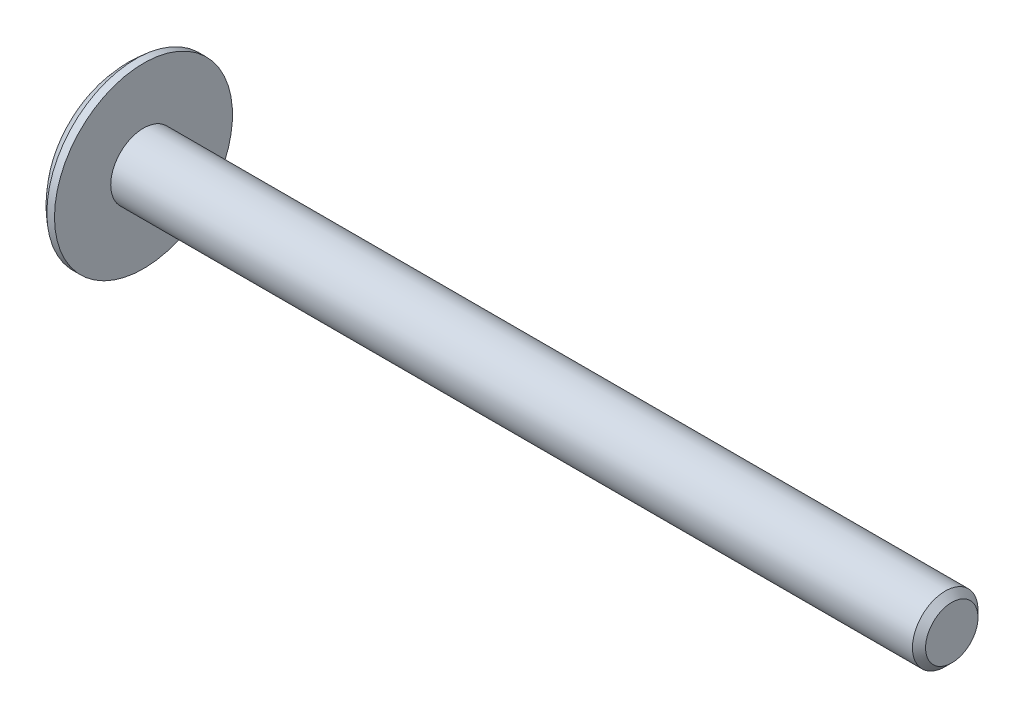
ISO-10303-21;
HEADER;
FILE_DESCRIPTION(('STEP AP214'),'2;1');
FILE_NAME('part.step','',(''),(''),'','','');
FILE_SCHEMA(('AUTOMOTIVE_DESIGN { 1 0 10303 214 1 1 1 1 }'));
ENDSEC;
DATA;
#1=APPLICATION_CONTEXT('core data for automotive mechanical design processes');
#2=APPLICATION_PROTOCOL_DEFINITION('international standard','automotive_design',2000,#1);
#3=PRODUCT_CONTEXT('',#1,'mechanical');
#4=PRODUCT('Part','Part','',(#3));
#5=PRODUCT_RELATED_PRODUCT_CATEGORY('part','',(#4));
#6=PRODUCT_DEFINITION_FORMATION('','',#4);
#7=PRODUCT_DEFINITION_CONTEXT('part definition',#1,'design');
#8=PRODUCT_DEFINITION('design','',#6,#7);
#9=PRODUCT_DEFINITION_SHAPE('','',#8);
#10=(LENGTH_UNIT() NAMED_UNIT(*) SI_UNIT(.MILLI.,.METRE.));
#11=(NAMED_UNIT(*) PLANE_ANGLE_UNIT() SI_UNIT($,.RADIAN.));
#12=(NAMED_UNIT(*) SI_UNIT($,.STERADIAN.) SOLID_ANGLE_UNIT());
#13=UNCERTAINTY_MEASURE_WITH_UNIT(LENGTH_MEASURE(1.E-05),#10,'distance_accuracy_value','');
#14=(GEOMETRIC_REPRESENTATION_CONTEXT(3) GLOBAL_UNCERTAINTY_ASSIGNED_CONTEXT((#13)) GLOBAL_UNIT_ASSIGNED_CONTEXT((#10,
#11,#12)) REPRESENTATION_CONTEXT('',''));
#15=CARTESIAN_POINT('',(0.,0.,0.));
#16=DIRECTION('',(0.,0.,1.));
#17=DIRECTION('',(1.,0.,0.));
#18=AXIS2_PLACEMENT_3D('',#15,#16,#17);
#19=CARTESIAN_POINT('',(0.,0.,0.));
#20=DIRECTION('',(1.,0.,0.));
#21=DIRECTION('',(0.,0.,-1.));
#22=AXIS2_PLACEMENT_3D('',#19,#20,#21);
#23=PLANE('',#22);
#24=DIRECTION('',(0.,-0.5,-0.866025403784439));
#25=VECTOR('',#24,1.);
#26=CARTESIAN_POINT('',(0.,1.15470053837925,0.));
#27=LINE('',#26,#25);
#28=CARTESIAN_POINT('',(0.,1.15470053837925,0.));
#29=VERTEX_POINT('',#28);
#30=CARTESIAN_POINT('',(0.,0.577350269189626,-1.));
#31=VERTEX_POINT('',#30);
#32=EDGE_CURVE('E131',#29,#31,#27,.T.);
#33=ORIENTED_EDGE('',*,*,#32,.F.);
#34=DIRECTION('',(0.,0.5,-0.866025403784439));
#35=VECTOR('',#34,1.);
#36=CARTESIAN_POINT('',(0.,0.577350269189626,1.));
#37=LINE('',#36,#35);
#38=CARTESIAN_POINT('',(0.,0.577350269189626,1.));
#39=VERTEX_POINT('',#38);
#40=EDGE_CURVE('E57',#39,#29,#37,.T.);
#41=ORIENTED_EDGE('',*,*,#40,.F.);
#42=DIRECTION('',(0.,1.,0.));
#43=VECTOR('',#42,1.);
#44=CARTESIAN_POINT('',(0.,-0.577350269189626,1.));
#45=LINE('',#44,#43);
#46=CARTESIAN_POINT('',(0.,-0.577350269189626,1.));
#47=VERTEX_POINT('',#46);
#48=EDGE_CURVE('E140',#47,#39,#45,.T.);
#49=ORIENTED_EDGE('',*,*,#48,.F.);
#50=DIRECTION('',(0.,0.5,0.866025403784439));
#51=VECTOR('',#50,1.);
#52=CARTESIAN_POINT('',(0.,-1.15470053837925,0.));
#53=LINE('',#52,#51);
#54=CARTESIAN_POINT('',(0.,-1.15470053837925,0.));
#55=VERTEX_POINT('',#54);
#56=EDGE_CURVE('E138',#55,#47,#53,.T.);
#57=ORIENTED_EDGE('',*,*,#56,.F.);
#58=DIRECTION('',(0.,-0.5,0.866025403784438));
#59=VECTOR('',#58,1.);
#60=CARTESIAN_POINT('',(0.,-0.577350269189626,-1.));
#61=LINE('',#60,#59);
#62=CARTESIAN_POINT('',(0.,-0.577350269189626,-1.));
#63=VERTEX_POINT('',#62);
#64=EDGE_CURVE('E105',#63,#55,#61,.T.);
#65=ORIENTED_EDGE('',*,*,#64,.F.);
#66=DIRECTION('',(0.,-1.,0.));
#67=VECTOR('',#66,1.);
#68=CARTESIAN_POINT('',(0.,0.577350269189626,-1.));
#69=LINE('',#68,#67);
#70=EDGE_CURVE('E134',#31,#63,#69,.T.);
#71=ORIENTED_EDGE('',*,*,#70,.F.);
#72=EDGE_LOOP('',(#33,#41,#49,#57,#65,#71));
#73=FACE_BOUND('',#72,.T.);
#74=CARTESIAN_POINT('',(0.,0.,0.));
#75=DIRECTION('',(-1.,0.,0.));
#76=DIRECTION('',(0.,0.,1.));
#77=AXIS2_PLACEMENT_3D('',#74,#75,#76);
#78=CIRCLE('',#77,1.425);
#79=CARTESIAN_POINT('',(0.,0.,1.425));
#80=VERTEX_POINT('',#79);
#81=EDGE_CURVE('E11',#80,#80,#78,.T.);
#82=ORIENTED_EDGE('',*,*,#81,.T.);
#83=EDGE_LOOP('',(#82));
#84=FACE_BOUND('',#83,.T.);
#85=ADVANCED_FACE('F43',(#73,#84),#23,.F.);
#86=CARTESIAN_POINT('',(3.35,0.,0.));
#87=DIRECTION('',(-1.,0.,0.));
#88=DIRECTION('',(0.,0.,1.));
#89=AXIS2_PLACEMENT_3D('',#86,#87,#88);
#90=DEGENERATE_TOROIDAL_SURFACE('',#89,1.425,3.35,.T.);
#91=ORIENTED_EDGE('',*,*,#81,.F.);
#92=EDGE_LOOP('',(#91));
#93=FACE_BOUND('',#92,.T.);
#94=CARTESIAN_POINT('',(1.3,0.,0.));
#95=DIRECTION('',(-1.,0.,0.));
#96=DIRECTION('',(0.,0.,1.));
#97=AXIS2_PLACEMENT_3D('',#94,#95,#96);
#98=CIRCLE('',#97,4.07452825989836);
#99=CARTESIAN_POINT('',(1.3,0.,4.07452825989836));
#100=VERTEX_POINT('',#99);
#101=EDGE_CURVE('E50',#100,#100,#98,.T.);
#102=ORIENTED_EDGE('',*,*,#101,.T.);
#103=EDGE_LOOP('',(#102));
#104=FACE_BOUND('',#103,.T.);
#105=ADVANCED_FACE('F163',(#93,#104),#90,.T.);
#106=CARTESIAN_POINT('',(0.,0.,0.));
#107=DIRECTION('',(-1.,0.,0.));
#108=DIRECTION('',(0.,0.,1.));
#109=AXIS2_PLACEMENT_3D('',#106,#107,#108);
#110=CYLINDRICAL_SURFACE('',#109,4.07452825989836);
#111=ORIENTED_EDGE('',*,*,#101,.F.);
#112=EDGE_LOOP('',(#111));
#113=FACE_BOUND('',#112,.T.);
#114=CARTESIAN_POINT('',(1.65,0.,0.));
#115=DIRECTION('',(-1.,0.,0.));
#116=DIRECTION('',(0.,0.,1.));
#117=AXIS2_PLACEMENT_3D('',#114,#115,#116);
#118=CIRCLE('',#117,4.07452825989836);
#119=CARTESIAN_POINT('',(1.65,0.,4.07452825989836));
#120=VERTEX_POINT('',#119);
#121=EDGE_CURVE('E158',#120,#120,#118,.T.);
#122=ORIENTED_EDGE('',*,*,#121,.T.);
#123=EDGE_LOOP('',(#122));
#124=FACE_BOUND('',#123,.T.);
#125=ADVANCED_FACE('F165',(#113,#124),#110,.T.);
#126=CARTESIAN_POINT('',(1.65,4.07452825989836,0.));
#127=DIRECTION('',(-1.,0.,0.));
#128=DIRECTION('',(0.,0.,1.));
#129=AXIS2_PLACEMENT_3D('',#126,#127,#128);
#130=PLANE('',#129);
#131=ORIENTED_EDGE('',*,*,#121,.F.);
#132=EDGE_LOOP('',(#131));
#133=FACE_BOUND('',#132,.T.);
#134=CARTESIAN_POINT('',(1.65,0.,0.));
#135=DIRECTION('',(-1.,0.,0.));
#136=DIRECTION('',(0.,0.,1.));
#137=AXIS2_PLACEMENT_3D('',#134,#135,#136);
#138=CIRCLE('',#137,1.5);
#139=CARTESIAN_POINT('',(1.65,0.,1.5));
#140=VERTEX_POINT('',#139);
#141=EDGE_CURVE('E155',#140,#140,#138,.T.);
#142=ORIENTED_EDGE('',*,*,#141,.T.);
#143=EDGE_LOOP('',(#142));
#144=FACE_BOUND('',#143,.T.);
#145=ADVANCED_FACE('F168',(#133,#144),#130,.F.);
#146=CARTESIAN_POINT('',(0.,0.,0.));
#147=DIRECTION('',(-1.,0.,0.));
#148=DIRECTION('',(0.,0.,1.));
#149=AXIS2_PLACEMENT_3D('',#146,#147,#148);
#150=CYLINDRICAL_SURFACE('',#149,1.5);
#151=ORIENTED_EDGE('',*,*,#141,.F.);
#152=EDGE_LOOP('',(#151));
#153=FACE_BOUND('',#152,.T.);
#154=CARTESIAN_POINT('',(38.35,0.,0.));
#155=DIRECTION('',(-1.,0.,0.));
#156=DIRECTION('',(0.,0.,1.));
#157=AXIS2_PLACEMENT_3D('',#154,#155,#156);
#158=CIRCLE('',#157,1.5);
#159=CARTESIAN_POINT('',(38.35,0.,1.5));
#160=VERTEX_POINT('',#159);
#161=EDGE_CURVE('E152',#160,#160,#158,.T.);
#162=ORIENTED_EDGE('',*,*,#161,.T.);
#163=EDGE_LOOP('',(#162));
#164=FACE_BOUND('',#163,.T.);
#165=ADVANCED_FACE('F174',(#153,#164),#150,.T.);
#166=CARTESIAN_POINT('',(38.65,0.,0.));
#167=DIRECTION('',(-1.,0.,0.));
#168=DIRECTION('',(0.,0.,1.));
#169=AXIS2_PLACEMENT_3D('',#166,#167,#168);
#170=CONICAL_SURFACE('',#169,1.2,0.78539816339745);
#171=ORIENTED_EDGE('',*,*,#161,.F.);
#172=EDGE_LOOP('',(#171));
#173=FACE_BOUND('',#172,.T.);
#174=CARTESIAN_POINT('',(38.65,0.,0.));
#175=DIRECTION('',(-1.,0.,0.));
#176=DIRECTION('',(0.,0.,1.));
#177=AXIS2_PLACEMENT_3D('',#174,#175,#176);
#178=CIRCLE('',#177,1.2);
#179=CARTESIAN_POINT('',(38.65,0.,1.2));
#180=VERTEX_POINT('',#179);
#181=EDGE_CURVE('E144',#180,#180,#178,.T.);
#182=ORIENTED_EDGE('',*,*,#181,.T.);
#183=EDGE_LOOP('',(#182));
#184=FACE_BOUND('',#183,.T.);
#185=ADVANCED_FACE('F180',(#173,#184),#170,.T.);
#186=CARTESIAN_POINT('',(38.65,1.2,0.));
#187=DIRECTION('',(-1.,0.,0.));
#188=DIRECTION('',(0.,0.,1.));
#189=AXIS2_PLACEMENT_3D('',#186,#187,#188);
#190=PLANE('',#189);
#191=ORIENTED_EDGE('',*,*,#181,.F.);
#192=EDGE_LOOP('',(#191));
#193=FACE_BOUND('',#192,.T.);
#194=ADVANCED_FACE('F186',(#193),#190,.F.);
#195=CARTESIAN_POINT('',(1.,0.577350269189626,1.));
#196=DIRECTION('',(0.,0.866025403784439,0.5));
#197=DIRECTION('',(0.,-0.5,0.866025403784439));
#198=AXIS2_PLACEMENT_3D('',#195,#196,#197);
#199=PLANE('',#198);
#200=ORIENTED_EDGE('',*,*,#40,.T.);
#201=DIRECTION('',(-1.,0.,0.));
#202=VECTOR('',#201,1.);
#203=CARTESIAN_POINT('',(1.,1.15470053837925,0.));
#204=LINE('',#203,#202);
#205=CARTESIAN_POINT('',(1.,1.15470053837925,0.));
#206=VERTEX_POINT('',#205);
#207=EDGE_CURVE('E87',#206,#29,#204,.T.);
#208=ORIENTED_EDGE('',*,*,#207,.F.);
#209=DIRECTION('',(0.,0.5,-0.866025403784439));
#210=VECTOR('',#209,1.);
#211=CARTESIAN_POINT('',(1.,0.577350269189626,1.));
#212=LINE('',#211,#210);
#213=CARTESIAN_POINT('',(1.,0.577350269189626,1.));
#214=VERTEX_POINT('',#213);
#215=EDGE_CURVE('E142',#214,#206,#212,.T.);
#216=ORIENTED_EDGE('',*,*,#215,.F.);
#217=DIRECTION('',(-1.,0.,0.));
#218=VECTOR('',#217,1.);
#219=CARTESIAN_POINT('',(1.,0.577350269189626,1.));
#220=LINE('',#219,#218);
#221=EDGE_CURVE('E65',#214,#39,#220,.T.);
#222=ORIENTED_EDGE('',*,*,#221,.T.);
#223=EDGE_LOOP('',(#200,#208,#216,#222));
#224=FACE_BOUND('',#223,.T.);
#225=ADVANCED_FACE('F191',(#224),#199,.F.);
#226=CARTESIAN_POINT('',(1.,-0.577350269189626,1.));
#227=DIRECTION('',(0.,0.,1.));
#228=DIRECTION('',(1.,0.,0.));
#229=AXIS2_PLACEMENT_3D('',#226,#227,#228);
#230=PLANE('',#229);
#231=ORIENTED_EDGE('',*,*,#48,.T.);
#232=ORIENTED_EDGE('',*,*,#221,.F.);
#233=DIRECTION('',(0.,1.,0.));
#234=VECTOR('',#233,1.);
#235=CARTESIAN_POINT('',(1.,-0.577350269189626,1.));
#236=LINE('',#235,#234);
#237=CARTESIAN_POINT('',(1.,-0.577350269189626,1.));
#238=VERTEX_POINT('',#237);
#239=EDGE_CURVE('E117',#238,#214,#236,.T.);
#240=ORIENTED_EDGE('',*,*,#239,.F.);
#241=DIRECTION('',(-1.,0.,0.));
#242=VECTOR('',#241,1.);
#243=CARTESIAN_POINT('',(1.,-0.577350269189626,1.));
#244=LINE('',#243,#242);
#245=EDGE_CURVE('E109',#238,#47,#244,.T.);
#246=ORIENTED_EDGE('',*,*,#245,.T.);
#247=EDGE_LOOP('',(#231,#232,#240,#246));
#248=FACE_BOUND('',#247,.T.);
#249=ADVANCED_FACE('F197',(#248),#230,.F.);
#250=CARTESIAN_POINT('',(1.,-1.15470053837925,0.));
#251=DIRECTION('',(0.,-0.866025403784439,0.5));
#252=DIRECTION('',(0.,-0.5,-0.866025403784439));
#253=AXIS2_PLACEMENT_3D('',#250,#251,#252);
#254=PLANE('',#253);
#255=ORIENTED_EDGE('',*,*,#56,.T.);
#256=ORIENTED_EDGE('',*,*,#245,.F.);
#257=DIRECTION('',(0.,0.5,0.866025403784439));
#258=VECTOR('',#257,1.);
#259=CARTESIAN_POINT('',(1.,-1.15470053837925,0.));
#260=LINE('',#259,#258);
#261=CARTESIAN_POINT('',(1.,-1.15470053837925,0.));
#262=VERTEX_POINT('',#261);
#263=EDGE_CURVE('E113',#262,#238,#260,.T.);
#264=ORIENTED_EDGE('',*,*,#263,.F.);
#265=DIRECTION('',(-1.,0.,0.));
#266=VECTOR('',#265,1.);
#267=CARTESIAN_POINT('',(1.,-1.15470053837925,0.));
#268=LINE('',#267,#266);
#269=EDGE_CURVE('E98',#262,#55,#268,.T.);
#270=ORIENTED_EDGE('',*,*,#269,.T.);
#271=EDGE_LOOP('',(#255,#256,#264,#270));
#272=FACE_BOUND('',#271,.T.);
#273=ADVANCED_FACE('F114',(#272),#254,.F.);
#274=CARTESIAN_POINT('',(1.,-0.577350269189626,-1.));
#275=DIRECTION('',(0.,-0.866025403784439,-0.5));
#276=DIRECTION('',(0.,0.5,-0.866025403784438));
#277=AXIS2_PLACEMENT_3D('',#274,#275,#276);
#278=PLANE('',#277);
#279=ORIENTED_EDGE('',*,*,#64,.T.);
#280=ORIENTED_EDGE('',*,*,#269,.F.);
#281=DIRECTION('',(0.,-0.5,0.866025403784438));
#282=VECTOR('',#281,1.);
#283=CARTESIAN_POINT('',(1.,-0.577350269189626,-1.));
#284=LINE('',#283,#282);
#285=CARTESIAN_POINT('',(1.,-0.577350269189626,-1.));
#286=VERTEX_POINT('',#285);
#287=EDGE_CURVE('E102',#286,#262,#284,.T.);
#288=ORIENTED_EDGE('',*,*,#287,.F.);
#289=DIRECTION('',(-1.,0.,0.));
#290=VECTOR('',#289,1.);
#291=CARTESIAN_POINT('',(1.,-0.577350269189626,-1.));
#292=LINE('',#291,#290);
#293=EDGE_CURVE('E110',#286,#63,#292,.T.);
#294=ORIENTED_EDGE('',*,*,#293,.T.);
#295=EDGE_LOOP('',(#279,#280,#288,#294));
#296=FACE_BOUND('',#295,.T.);
#297=ADVANCED_FACE('F100',(#296),#278,.F.);
#298=CARTESIAN_POINT('',(1.,0.577350269189626,-1.));
#299=DIRECTION('',(0.,0.,-1.));
#300=DIRECTION('',(-1.,0.,0.));
#301=AXIS2_PLACEMENT_3D('',#298,#299,#300);
#302=PLANE('',#301);
#303=ORIENTED_EDGE('',*,*,#70,.T.);
#304=ORIENTED_EDGE('',*,*,#293,.F.);
#305=DIRECTION('',(0.,-1.,0.));
#306=VECTOR('',#305,1.);
#307=CARTESIAN_POINT('',(1.,0.577350269189626,-1.));
#308=LINE('',#307,#306);
#309=CARTESIAN_POINT('',(1.,0.577350269189626,-1.));
#310=VERTEX_POINT('',#309);
#311=EDGE_CURVE('E123',#310,#286,#308,.T.);
#312=ORIENTED_EDGE('',*,*,#311,.F.);
#313=DIRECTION('',(-1.,0.,0.));
#314=VECTOR('',#313,1.);
#315=CARTESIAN_POINT('',(1.,0.577350269189626,-1.));
#316=LINE('',#315,#314);
#317=EDGE_CURVE('E147',#310,#31,#316,.T.);
#318=ORIENTED_EDGE('',*,*,#317,.T.);
#319=EDGE_LOOP('',(#303,#304,#312,#318));
#320=FACE_BOUND('',#319,.T.);
#321=ADVANCED_FACE('F222',(#320),#302,.F.);
#322=CARTESIAN_POINT('',(1.,1.15470053837925,0.));
#323=DIRECTION('',(0.,0.866025403784439,-0.5));
#324=DIRECTION('',(0.,0.5,0.866025403784439));
#325=AXIS2_PLACEMENT_3D('',#322,#323,#324);
#326=PLANE('',#325);
#327=ORIENTED_EDGE('',*,*,#32,.T.);
#328=ORIENTED_EDGE('',*,*,#317,.F.);
#329=DIRECTION('',(0.,-0.5,-0.866025403784439));
#330=VECTOR('',#329,1.);
#331=CARTESIAN_POINT('',(1.,1.15470053837925,0.));
#332=LINE('',#331,#330);
#333=EDGE_CURVE('E125',#206,#310,#332,.T.);
#334=ORIENTED_EDGE('',*,*,#333,.F.);
#335=ORIENTED_EDGE('',*,*,#207,.T.);
#336=EDGE_LOOP('',(#327,#328,#334,#335));
#337=FACE_BOUND('',#336,.T.);
#338=ADVANCED_FACE('F210',(#337),#326,.F.);
#339=CARTESIAN_POINT('',(1.,0.,0.));
#340=DIRECTION('',(-1.,0.,0.));
#341=DIRECTION('',(0.,0.,1.));
#342=AXIS2_PLACEMENT_3D('',#339,#340,#341);
#343=PLANE('',#342);
#344=ORIENTED_EDGE('',*,*,#215,.T.);
#345=ORIENTED_EDGE('',*,*,#333,.T.);
#346=ORIENTED_EDGE('',*,*,#311,.T.);
#347=ORIENTED_EDGE('',*,*,#287,.T.);
#348=ORIENTED_EDGE('',*,*,#263,.T.);
#349=ORIENTED_EDGE('',*,*,#239,.T.);
#350=EDGE_LOOP('',(#344,#345,#346,#347,#348,#349));
#351=FACE_BOUND('',#350,.T.);
#352=ADVANCED_FACE('F120',(#351),#343,.T.);
#353=CLOSED_SHELL('',(#85,#105,#125,#145,#165,#185,#194,#225,#249,#273,#297,#321,#338,#352));
#354=MANIFOLD_SOLID_BREP('B2',#353);
#355=ADVANCED_BREP_SHAPE_REPRESENTATION('',(#18,#354),#14);
#356=SHAPE_DEFINITION_REPRESENTATION(#9,#355);
ENDSEC;
END-ISO-10303-21;
